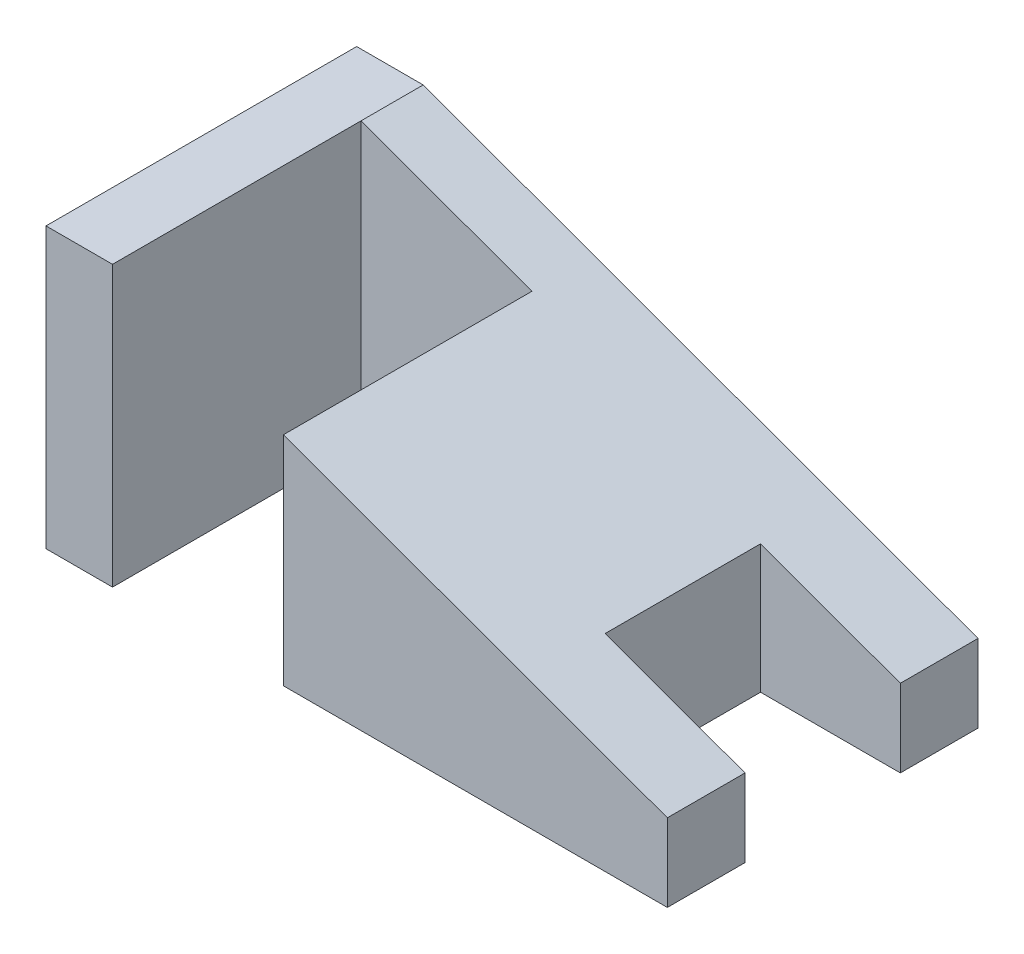
ISO-10303-21;
HEADER;
FILE_DESCRIPTION(('STEP AP214'),'2;1');
FILE_NAME('part.step','',(''),(''),'','','');
FILE_SCHEMA(('AUTOMOTIVE_DESIGN { 1 0 10303 214 1 1 1 1 }'));
ENDSEC;
DATA;
#1=APPLICATION_CONTEXT('core data for automotive mechanical design processes');
#2=APPLICATION_PROTOCOL_DEFINITION('international standard','automotive_design',2000,#1);
#3=PRODUCT_CONTEXT('',#1,'mechanical');
#4=PRODUCT('Part','Part','',(#3));
#5=PRODUCT_RELATED_PRODUCT_CATEGORY('part','',(#4));
#6=PRODUCT_DEFINITION_FORMATION('','',#4);
#7=PRODUCT_DEFINITION_CONTEXT('part definition',#1,'design');
#8=PRODUCT_DEFINITION('design','',#6,#7);
#9=PRODUCT_DEFINITION_SHAPE('','',#8);
#10=(LENGTH_UNIT() NAMED_UNIT(*) SI_UNIT(.MILLI.,.METRE.));
#11=(NAMED_UNIT(*) PLANE_ANGLE_UNIT() SI_UNIT($,.RADIAN.));
#12=(NAMED_UNIT(*) SI_UNIT($,.STERADIAN.) SOLID_ANGLE_UNIT());
#13=UNCERTAINTY_MEASURE_WITH_UNIT(LENGTH_MEASURE(1.E-05),#10,'distance_accuracy_value','');
#14=(GEOMETRIC_REPRESENTATION_CONTEXT(3) GLOBAL_UNCERTAINTY_ASSIGNED_CONTEXT((#13)) GLOBAL_UNIT_ASSIGNED_CONTEXT((#10,
#11,#12)) REPRESENTATION_CONTEXT('',''));
#15=CARTESIAN_POINT('',(0.,0.,0.));
#16=DIRECTION('',(0.,0.,1.));
#17=DIRECTION('',(1.,0.,0.));
#18=AXIS2_PLACEMENT_3D('',#15,#16,#17);
#19=CARTESIAN_POINT('',(200.,0.,100.));
#20=DIRECTION('',(-1.,0.,0.));
#21=DIRECTION('',(0.,0.,1.));
#22=AXIS2_PLACEMENT_3D('',#19,#20,#21);
#23=PLANE('',#22);
#24=DIRECTION('',(0.,1.,0.));
#25=VECTOR('',#24,1.);
#26=CARTESIAN_POINT('',(200.,-97.082439194738,25.));
#27=LINE('',#26,#25);
#28=CARTESIAN_POINT('',(200.,0.,25.));
#29=VERTEX_POINT('',#28);
#30=CARTESIAN_POINT('',(200.,25.,25.));
#31=VERTEX_POINT('',#30);
#32=EDGE_CURVE('E193',#29,#31,#27,.T.);
#33=ORIENTED_EDGE('',*,*,#32,.F.);
#34=DIRECTION('',(0.,0.,-1.));
#35=VECTOR('',#34,1.);
#36=CARTESIAN_POINT('',(200.,0.,100.));
#37=LINE('',#36,#35);
#38=CARTESIAN_POINT('',(200.,0.,0.));
#39=VERTEX_POINT('',#38);
#40=EDGE_CURVE('E173',#29,#39,#37,.T.);
#41=ORIENTED_EDGE('',*,*,#40,.T.);
#42=DIRECTION('',(0.,1.,0.));
#43=VECTOR('',#42,1.);
#44=CARTESIAN_POINT('',(200.,0.,0.));
#45=LINE('',#44,#43);
#46=CARTESIAN_POINT('',(200.,25.,0.));
#47=VERTEX_POINT('',#46);
#48=EDGE_CURVE('E214',#39,#47,#45,.T.);
#49=ORIENTED_EDGE('',*,*,#48,.T.);
#50=DIRECTION('',(0.,0.,-1.));
#51=VECTOR('',#50,1.);
#52=CARTESIAN_POINT('',(200.,25.,100.));
#53=LINE('',#52,#51);
#54=EDGE_CURVE('E162',#31,#47,#53,.T.);
#55=ORIENTED_EDGE('',*,*,#54,.F.);
#56=EDGE_LOOP('',(#33,#41,#49,#55));
#57=FACE_BOUND('',#56,.T.);
#58=ADVANCED_FACE('F41',(#57),#23,.F.);
#59=CARTESIAN_POINT('',(0.,0.,100.));
#60=DIRECTION('',(0.,1.,0.));
#61=DIRECTION('',(0.,0.,1.));
#62=AXIS2_PLACEMENT_3D('',#59,#60,#61);
#63=PLANE('',#62);
#64=DIRECTION('',(-1.,0.,0.));
#65=VECTOR('',#64,1.);
#66=CARTESIAN_POINT('',(0.,0.,20.));
#67=LINE('',#66,#65);
#68=CARTESIAN_POINT('',(76.4139677354461,0.,20.));
#69=VERTEX_POINT('',#68);
#70=CARTESIAN_POINT('',(21.4139677354461,0.,20.));
#71=VERTEX_POINT('',#70);
#72=EDGE_CURVE('E264',#69,#71,#67,.T.);
#73=ORIENTED_EDGE('',*,*,#72,.T.);
#74=DIRECTION('',(0.,0.,1.));
#75=VECTOR('',#74,1.);
#76=CARTESIAN_POINT('',(21.4139677354461,0.,0.));
#77=LINE('',#76,#75);
#78=CARTESIAN_POINT('',(21.4139677354461,0.,100.));
#79=VERTEX_POINT('',#78);
#80=EDGE_CURVE('E150',#71,#79,#77,.T.);
#81=ORIENTED_EDGE('',*,*,#80,.T.);
#82=DIRECTION('',(1.,0.,0.));
#83=VECTOR('',#82,1.);
#84=CARTESIAN_POINT('',(0.,0.,100.));
#85=LINE('',#84,#83);
#86=CARTESIAN_POINT('',(0.,0.,100.));
#87=VERTEX_POINT('',#86);
#88=EDGE_CURVE('E203',#87,#79,#85,.T.);
#89=ORIENTED_EDGE('',*,*,#88,.F.);
#90=DIRECTION('',(0.,0.,-1.));
#91=VECTOR('',#90,1.);
#92=CARTESIAN_POINT('',(0.,0.,100.));
#93=LINE('',#92,#91);
#94=CARTESIAN_POINT('',(0.,0.,0.));
#95=VERTEX_POINT('',#94);
#96=EDGE_CURVE('E213',#87,#95,#93,.T.);
#97=ORIENTED_EDGE('',*,*,#96,.T.);
#98=DIRECTION('',(1.,0.,0.));
#99=VECTOR('',#98,1.);
#100=CARTESIAN_POINT('',(0.,0.,0.));
#101=LINE('',#100,#99);
#102=EDGE_CURVE('E212',#95,#39,#101,.T.);
#103=ORIENTED_EDGE('',*,*,#102,.T.);
#104=ORIENTED_EDGE('',*,*,#40,.F.);
#105=DIRECTION('',(1.,0.,0.));
#106=VECTOR('',#105,1.);
#107=CARTESIAN_POINT('',(0.,0.,25.));
#108=LINE('',#107,#106);
#109=CARTESIAN_POINT('',(155.,0.,25.));
#110=VERTEX_POINT('',#109);
#111=EDGE_CURVE('E240',#110,#29,#108,.T.);
#112=ORIENTED_EDGE('',*,*,#111,.F.);
#113=DIRECTION('',(0.,0.,1.));
#114=VECTOR('',#113,1.);
#115=CARTESIAN_POINT('',(155.,0.,0.));
#116=LINE('',#115,#114);
#117=CARTESIAN_POINT('',(155.,0.,75.));
#118=VERTEX_POINT('',#117);
#119=EDGE_CURVE('E254',#110,#118,#116,.T.);
#120=ORIENTED_EDGE('',*,*,#119,.T.);
#121=DIRECTION('',(1.,0.,0.));
#122=VECTOR('',#121,1.);
#123=CARTESIAN_POINT('',(0.,0.,75.0000000000001));
#124=LINE('',#123,#122);
#125=CARTESIAN_POINT('',(200.,0.,75.));
#126=VERTEX_POINT('',#125);
#127=EDGE_CURVE('E241',#118,#126,#124,.T.);
#128=ORIENTED_EDGE('',*,*,#127,.T.);
#129=CARTESIAN_POINT('',(200.,0.,100.));
#130=VERTEX_POINT('',#129);
#131=EDGE_CURVE('E175',#130,#126,#37,.T.);
#132=ORIENTED_EDGE('',*,*,#131,.F.);
#133=CARTESIAN_POINT('',(76.4139677354461,0.,100.));
#134=VERTEX_POINT('',#133);
#135=EDGE_CURVE('E223',#134,#130,#85,.T.);
#136=ORIENTED_EDGE('',*,*,#135,.F.);
#137=DIRECTION('',(0.,0.,1.));
#138=VECTOR('',#137,1.);
#139=CARTESIAN_POINT('',(76.4139677354461,0.,0.));
#140=LINE('',#139,#138);
#141=EDGE_CURVE('E249',#69,#134,#140,.T.);
#142=ORIENTED_EDGE('',*,*,#141,.F.);
#143=EDGE_LOOP('',(#73,#81,#89,#97,#103,#104,#112,#120,#128,#132,#136,#142));
#144=FACE_BOUND('',#143,.T.);
#145=ADVANCED_FACE('F43',(#144),#63,.F.);
#146=CARTESIAN_POINT('',(31.430400809183,86.3543165076403,100.));
#147=DIRECTION('',(-0.342020143325663,-0.939692620785911,0.));
#148=DIRECTION('',(0.939692620785911,-0.342020143325663,0.));
#149=AXIS2_PLACEMENT_3D('',#146,#147,#148);
#150=PLANE('',#149);
#151=DIRECTION('',(-0.939692620785911,0.342020143325663,0.));
#152=VECTOR('',#151,1.);
#153=CARTESIAN_POINT('',(31.430400809183,86.3543165076403,20.));
#154=LINE('',#153,#152);
#155=CARTESIAN_POINT('',(76.4139677354461,69.9816371153593,20.));
#156=VERTEX_POINT('',#155);
#157=CARTESIAN_POINT('',(21.4139677354461,90.,20.));
#158=VERTEX_POINT('',#157);
#159=EDGE_CURVE('E11',#156,#158,#154,.T.);
#160=ORIENTED_EDGE('',*,*,#159,.F.);
#161=DIRECTION('',(0.,0.,1.));
#162=VECTOR('',#161,1.);
#163=CARTESIAN_POINT('',(76.4139677354461,69.9816371153593,100.));
#164=LINE('',#163,#162);
#165=CARTESIAN_POINT('',(76.4139677354461,69.9816371153593,100.));
#166=VERTEX_POINT('',#165);
#167=EDGE_CURVE('E197',#156,#166,#164,.T.);
#168=ORIENTED_EDGE('',*,*,#167,.T.);
#169=DIRECTION('',(-0.939692620785911,0.342020143325663,0.));
#170=VECTOR('',#169,1.);
#171=CARTESIAN_POINT('',(31.430400809183,86.3543165076403,100.));
#172=LINE('',#171,#170);
#173=CARTESIAN_POINT('',(200.,25.,100.));
#174=VERTEX_POINT('',#173);
#175=EDGE_CURVE('E196',#174,#166,#172,.T.);
#176=ORIENTED_EDGE('',*,*,#175,.F.);
#177=CARTESIAN_POINT('',(200.,25.,75.));
#178=VERTEX_POINT('',#177);
#179=EDGE_CURVE('E164',#174,#178,#53,.T.);
#180=ORIENTED_EDGE('',*,*,#179,.T.);
#181=DIRECTION('',(0.939692620785911,-0.342020143325663,0.));
#182=VECTOR('',#181,1.);
#183=CARTESIAN_POINT('',(31.430400809183,86.3543165076403,75.0000000000001));
#184=LINE('',#183,#182);
#185=CARTESIAN_POINT('',(155.,41.3786605419788,75.));
#186=VERTEX_POINT('',#185);
#187=EDGE_CURVE('E47',#186,#178,#184,.T.);
#188=ORIENTED_EDGE('',*,*,#187,.F.);
#189=DIRECTION('',(0.,0.,1.));
#190=VECTOR('',#189,1.);
#191=CARTESIAN_POINT('',(155.,41.3786605419788,100.));
#192=LINE('',#191,#190);
#193=CARTESIAN_POINT('',(155.,41.3786605419788,25.));
#194=VERTEX_POINT('',#193);
#195=EDGE_CURVE('E172',#194,#186,#192,.T.);
#196=ORIENTED_EDGE('',*,*,#195,.F.);
#197=DIRECTION('',(0.939692620785911,-0.342020143325663,0.));
#198=VECTOR('',#197,1.);
#199=CARTESIAN_POINT('',(31.430400809183,86.3543165076403,25.));
#200=LINE('',#199,#198);
#201=EDGE_CURVE('E180',#194,#31,#200,.T.);
#202=ORIENTED_EDGE('',*,*,#201,.T.);
#203=ORIENTED_EDGE('',*,*,#54,.T.);
#204=DIRECTION('',(-0.939692620785911,0.342020143325663,0.));
#205=VECTOR('',#204,1.);
#206=CARTESIAN_POINT('',(31.430400809183,86.3543165076403,0.));
#207=LINE('',#206,#205);
#208=CARTESIAN_POINT('',(21.4139677354461,90.,0.));
#209=VERTEX_POINT('',#208);
#210=EDGE_CURVE('E152',#47,#209,#207,.T.);
#211=ORIENTED_EDGE('',*,*,#210,.T.);
#212=DIRECTION('',(0.,0.,-1.));
#213=VECTOR('',#212,1.);
#214=CARTESIAN_POINT('',(21.4139677354461,90.,100.));
#215=LINE('',#214,#213);
#216=EDGE_CURVE('E153',#158,#209,#215,.T.);
#217=ORIENTED_EDGE('',*,*,#216,.F.);
#218=EDGE_LOOP('',(#160,#168,#176,#180,#188,#196,#202,#203,#211,#217));
#219=FACE_BOUND('',#218,.T.);
#220=ADVANCED_FACE('F155',(#219),#150,.F.);
#221=CARTESIAN_POINT('',(0.,0.,100.));
#222=DIRECTION('',(0.,0.,1.));
#223=DIRECTION('',(1.,0.,0.));
#224=AXIS2_PLACEMENT_3D('',#221,#222,#223);
#225=PLANE('',#224);
#226=ORIENTED_EDGE('',*,*,#88,.T.);
#227=DIRECTION('',(0.,1.,0.));
#228=VECTOR('',#227,1.);
#229=CARTESIAN_POINT('',(21.4139677354461,-97.082439194738,100.));
#230=LINE('',#229,#228);
#231=CARTESIAN_POINT('',(21.4139677354461,90.,100.));
#232=VERTEX_POINT('',#231);
#233=EDGE_CURVE('E149',#79,#232,#230,.T.);
#234=ORIENTED_EDGE('',*,*,#233,.T.);
#235=DIRECTION('',(1.,0.,0.));
#236=VECTOR('',#235,1.);
#237=CARTESIAN_POINT('',(0.,90.,100.));
#238=LINE('',#237,#236);
#239=CARTESIAN_POINT('',(0.,90.,100.));
#240=VERTEX_POINT('',#239);
#241=EDGE_CURVE('E161',#240,#232,#238,.T.);
#242=ORIENTED_EDGE('',*,*,#241,.F.);
#243=DIRECTION('',(0.,1.,0.));
#244=VECTOR('',#243,1.);
#245=CARTESIAN_POINT('',(0.,0.,100.));
#246=LINE('',#245,#244);
#247=EDGE_CURVE('E201',#87,#240,#246,.T.);
#248=ORIENTED_EDGE('',*,*,#247,.F.);
#249=EDGE_LOOP('',(#226,#234,#242,#248));
#250=FACE_BOUND('',#249,.T.);
#251=ADVANCED_FACE('F284',(#250),#225,.T.);
#252=ORIENTED_EDGE('',*,*,#131,.T.);
#253=DIRECTION('',(0.,1.,0.));
#254=VECTOR('',#253,1.);
#255=CARTESIAN_POINT('',(200.,-97.082439194738,75.));
#256=LINE('',#255,#254);
#257=EDGE_CURVE('E182',#126,#178,#256,.T.);
#258=ORIENTED_EDGE('',*,*,#257,.T.);
#259=ORIENTED_EDGE('',*,*,#179,.F.);
#260=DIRECTION('',(0.,1.,0.));
#261=VECTOR('',#260,1.);
#262=CARTESIAN_POINT('',(200.,0.,100.));
#263=LINE('',#262,#261);
#264=EDGE_CURVE('E202',#130,#174,#263,.T.);
#265=ORIENTED_EDGE('',*,*,#264,.F.);
#266=EDGE_LOOP('',(#252,#258,#259,#265));
#267=FACE_BOUND('',#266,.T.);
#268=ADVANCED_FACE('F192',(#267),#23,.F.);
#269=CARTESIAN_POINT('',(0.,90.,100.));
#270=DIRECTION('',(0.,1.,0.));
#271=DIRECTION('',(0.,0.,1.));
#272=AXIS2_PLACEMENT_3D('',#269,#270,#271);
#273=PLANE('',#272);
#274=DIRECTION('',(1.,0.,0.));
#275=VECTOR('',#274,1.);
#276=CARTESIAN_POINT('',(0.,90.,0.));
#277=LINE('',#276,#275);
#278=CARTESIAN_POINT('',(0.,90.,0.));
#279=VERTEX_POINT('',#278);
#280=EDGE_CURVE('E219',#279,#209,#277,.T.);
#281=ORIENTED_EDGE('',*,*,#280,.F.);
#282=DIRECTION('',(0.,0.,-1.));
#283=VECTOR('',#282,1.);
#284=CARTESIAN_POINT('',(0.,90.,100.));
#285=LINE('',#284,#283);
#286=EDGE_CURVE('E156',#240,#279,#285,.T.);
#287=ORIENTED_EDGE('',*,*,#286,.F.);
#288=ORIENTED_EDGE('',*,*,#241,.T.);
#289=EDGE_CURVE('E143',#232,#158,#215,.T.);
#290=ORIENTED_EDGE('',*,*,#289,.T.);
#291=ORIENTED_EDGE('',*,*,#216,.T.);
#292=EDGE_LOOP('',(#281,#287,#288,#290,#291));
#293=FACE_BOUND('',#292,.T.);
#294=ADVANCED_FACE('F163',(#293),#273,.T.);
#295=CARTESIAN_POINT('',(0.,0.,100.));
#296=DIRECTION('',(-1.,0.,0.));
#297=DIRECTION('',(0.,0.,1.));
#298=AXIS2_PLACEMENT_3D('',#295,#296,#297);
#299=PLANE('',#298);
#300=DIRECTION('',(0.,1.,0.));
#301=VECTOR('',#300,1.);
#302=CARTESIAN_POINT('',(0.,0.,0.));
#303=LINE('',#302,#301);
#304=EDGE_CURVE('E221',#95,#279,#303,.T.);
#305=ORIENTED_EDGE('',*,*,#304,.F.);
#306=ORIENTED_EDGE('',*,*,#96,.F.);
#307=ORIENTED_EDGE('',*,*,#247,.T.);
#308=ORIENTED_EDGE('',*,*,#286,.T.);
#309=EDGE_LOOP('',(#305,#306,#307,#308));
#310=FACE_BOUND('',#309,.T.);
#311=ADVANCED_FACE('F227',(#310),#299,.T.);
#312=DIRECTION('',(0.,1.,0.));
#313=VECTOR('',#312,1.);
#314=CARTESIAN_POINT('',(76.4139677354461,-97.082439194738,100.));
#315=LINE('',#314,#313);
#316=EDGE_CURVE('E62',#134,#166,#315,.T.);
#317=ORIENTED_EDGE('',*,*,#316,.F.);
#318=ORIENTED_EDGE('',*,*,#135,.T.);
#319=ORIENTED_EDGE('',*,*,#264,.T.);
#320=ORIENTED_EDGE('',*,*,#175,.T.);
#321=EDGE_LOOP('',(#317,#318,#319,#320));
#322=FACE_BOUND('',#321,.T.);
#323=ADVANCED_FACE('F251',(#322),#225,.T.);
#324=CARTESIAN_POINT('',(0.,0.,0.));
#325=DIRECTION('',(0.,0.,1.));
#326=DIRECTION('',(1.,0.,0.));
#327=AXIS2_PLACEMENT_3D('',#324,#325,#326);
#328=PLANE('',#327);
#329=ORIENTED_EDGE('',*,*,#102,.F.);
#330=ORIENTED_EDGE('',*,*,#304,.T.);
#331=ORIENTED_EDGE('',*,*,#280,.T.);
#332=ORIENTED_EDGE('',*,*,#210,.F.);
#333=ORIENTED_EDGE('',*,*,#48,.F.);
#334=EDGE_LOOP('',(#329,#330,#331,#332,#333));
#335=FACE_BOUND('',#334,.T.);
#336=ADVANCED_FACE('F235',(#335),#328,.F.);
#337=CARTESIAN_POINT('',(0.,-97.082439194738,75.0000000000001));
#338=DIRECTION('',(0.,0.,-1.));
#339=DIRECTION('',(-1.,0.,0.));
#340=AXIS2_PLACEMENT_3D('',#337,#338,#339);
#341=PLANE('',#340);
#342=ORIENTED_EDGE('',*,*,#187,.T.);
#343=ORIENTED_EDGE('',*,*,#257,.F.);
#344=ORIENTED_EDGE('',*,*,#127,.F.);
#345=DIRECTION('',(0.,1.,0.));
#346=VECTOR('',#345,1.);
#347=CARTESIAN_POINT('',(155.,-97.082439194738,75.));
#348=LINE('',#347,#346);
#349=EDGE_CURVE('E190',#118,#186,#348,.T.);
#350=ORIENTED_EDGE('',*,*,#349,.T.);
#351=EDGE_LOOP('',(#342,#343,#344,#350));
#352=FACE_BOUND('',#351,.T.);
#353=ADVANCED_FACE('F183',(#352),#341,.T.);
#354=CARTESIAN_POINT('',(0.,-97.082439194738,25.));
#355=DIRECTION('',(0.,0.,-1.));
#356=DIRECTION('',(-1.,0.,0.));
#357=AXIS2_PLACEMENT_3D('',#354,#355,#356);
#358=PLANE('',#357);
#359=DIRECTION('',(0.,1.,0.));
#360=VECTOR('',#359,1.);
#361=CARTESIAN_POINT('',(155.,-97.082439194738,25.));
#362=LINE('',#361,#360);
#363=EDGE_CURVE('E57',#110,#194,#362,.T.);
#364=ORIENTED_EDGE('',*,*,#363,.F.);
#365=ORIENTED_EDGE('',*,*,#111,.T.);
#366=ORIENTED_EDGE('',*,*,#32,.T.);
#367=ORIENTED_EDGE('',*,*,#201,.F.);
#368=EDGE_LOOP('',(#364,#365,#366,#367));
#369=FACE_BOUND('',#368,.T.);
#370=ADVANCED_FACE('F257',(#369),#358,.F.);
#371=CARTESIAN_POINT('',(155.,-97.082439194738,0.));
#372=DIRECTION('',(1.,0.,0.));
#373=DIRECTION('',(0.,0.,-1.));
#374=AXIS2_PLACEMENT_3D('',#371,#372,#373);
#375=PLANE('',#374);
#376=ORIENTED_EDGE('',*,*,#195,.T.);
#377=ORIENTED_EDGE('',*,*,#349,.F.);
#378=ORIENTED_EDGE('',*,*,#119,.F.);
#379=ORIENTED_EDGE('',*,*,#363,.T.);
#380=EDGE_LOOP('',(#376,#377,#378,#379));
#381=FACE_BOUND('',#380,.T.);
#382=ADVANCED_FACE('F258',(#381),#375,.T.);
#383=CARTESIAN_POINT('',(0.,-97.082439194738,20.));
#384=DIRECTION('',(0.,0.,1.));
#385=DIRECTION('',(1.,0.,0.));
#386=AXIS2_PLACEMENT_3D('',#383,#384,#385);
#387=PLANE('',#386);
#388=ORIENTED_EDGE('',*,*,#159,.T.);
#389=DIRECTION('',(0.,1.,0.));
#390=VECTOR('',#389,1.);
#391=CARTESIAN_POINT('',(21.4139677354461,-97.082439194738,20.));
#392=LINE('',#391,#390);
#393=EDGE_CURVE('E134',#71,#158,#392,.T.);
#394=ORIENTED_EDGE('',*,*,#393,.F.);
#395=ORIENTED_EDGE('',*,*,#72,.F.);
#396=DIRECTION('',(0.,1.,0.));
#397=VECTOR('',#396,1.);
#398=CARTESIAN_POINT('',(76.4139677354461,-97.082439194738,20.));
#399=LINE('',#398,#397);
#400=EDGE_CURVE('E138',#69,#156,#399,.T.);
#401=ORIENTED_EDGE('',*,*,#400,.T.);
#402=EDGE_LOOP('',(#388,#394,#395,#401));
#403=FACE_BOUND('',#402,.T.);
#404=ADVANCED_FACE('F132',(#403),#387,.T.);
#405=CARTESIAN_POINT('',(76.4139677354461,-97.082439194738,0.));
#406=DIRECTION('',(1.,0.,0.));
#407=DIRECTION('',(0.,0.,-1.));
#408=AXIS2_PLACEMENT_3D('',#405,#406,#407);
#409=PLANE('',#408);
#410=ORIENTED_EDGE('',*,*,#400,.F.);
#411=ORIENTED_EDGE('',*,*,#141,.T.);
#412=ORIENTED_EDGE('',*,*,#316,.T.);
#413=ORIENTED_EDGE('',*,*,#167,.F.);
#414=EDGE_LOOP('',(#410,#411,#412,#413));
#415=FACE_BOUND('',#414,.T.);
#416=ADVANCED_FACE('F266',(#415),#409,.F.);
#417=CARTESIAN_POINT('',(21.4139677354461,-97.082439194738,0.));
#418=DIRECTION('',(1.,0.,0.));
#419=DIRECTION('',(0.,0.,-1.));
#420=AXIS2_PLACEMENT_3D('',#417,#418,#419);
#421=PLANE('',#420);
#422=ORIENTED_EDGE('',*,*,#393,.T.);
#423=ORIENTED_EDGE('',*,*,#289,.F.);
#424=ORIENTED_EDGE('',*,*,#233,.F.);
#425=ORIENTED_EDGE('',*,*,#80,.F.);
#426=EDGE_LOOP('',(#422,#423,#424,#425));
#427=FACE_BOUND('',#426,.T.);
#428=ADVANCED_FACE('F145',(#427),#421,.T.);
#429=CLOSED_SHELL('',(#58,#145,#220,#251,#268,#294,#311,#323,#336,#353,#370,#382,#404,#416,#428));
#430=MANIFOLD_SOLID_BREP('B2',#429);
#431=ADVANCED_BREP_SHAPE_REPRESENTATION('',(#18,#430),#14);
#432=SHAPE_DEFINITION_REPRESENTATION(#9,#431);
ENDSEC;
END-ISO-10303-21;
